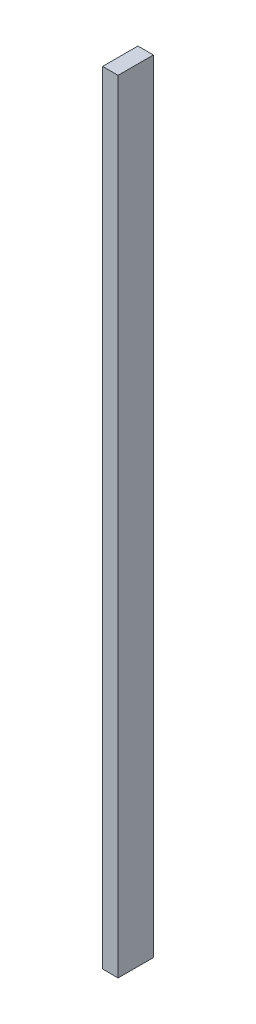
ISO-10303-21;
HEADER;
FILE_DESCRIPTION(('STEP AP214'),'2;1');
FILE_NAME('part.step','',(''),(''),'','','');
FILE_SCHEMA(('AUTOMOTIVE_DESIGN { 1 0 10303 214 1 1 1 1 }'));
ENDSEC;
DATA;
#1=APPLICATION_CONTEXT('core data for automotive mechanical design processes');
#2=APPLICATION_PROTOCOL_DEFINITION('international standard','automotive_design',2000,#1);
#3=PRODUCT_CONTEXT('',#1,'mechanical');
#4=PRODUCT('Part','Part','',(#3));
#5=PRODUCT_RELATED_PRODUCT_CATEGORY('part','',(#4));
#6=PRODUCT_DEFINITION_FORMATION('','',#4);
#7=PRODUCT_DEFINITION_CONTEXT('part definition',#1,'design');
#8=PRODUCT_DEFINITION('design','',#6,#7);
#9=PRODUCT_DEFINITION_SHAPE('','',#8);
#10=(LENGTH_UNIT() NAMED_UNIT(*) SI_UNIT(.MILLI.,.METRE.));
#11=(NAMED_UNIT(*) PLANE_ANGLE_UNIT() SI_UNIT($,.RADIAN.));
#12=(NAMED_UNIT(*) SI_UNIT($,.STERADIAN.) SOLID_ANGLE_UNIT());
#13=UNCERTAINTY_MEASURE_WITH_UNIT(LENGTH_MEASURE(1.E-05),#10,'distance_accuracy_value','');
#14=(GEOMETRIC_REPRESENTATION_CONTEXT(3) GLOBAL_UNCERTAINTY_ASSIGNED_CONTEXT((#13)) GLOBAL_UNIT_ASSIGNED_CONTEXT((#10,
#11,#12)) REPRESENTATION_CONTEXT('',''));
#15=CARTESIAN_POINT('',(0.,0.,0.));
#16=DIRECTION('',(0.,0.,1.));
#17=DIRECTION('',(1.,0.,0.));
#18=AXIS2_PLACEMENT_3D('',#15,#16,#17);
#19=CARTESIAN_POINT('',(50.8000000000068,5130.80000000001,-115.887499999998));
#20=DIRECTION('',(-1.,0.,0.));
#21=DIRECTION('',(0.,0.,1.));
#22=AXIS2_PLACEMENT_3D('',#19,#20,#21);
#23=PLANE('',#22);
#24=DIRECTION('',(0.,0.,-1.));
#25=VECTOR('',#24,1.);
#26=CARTESIAN_POINT('',(50.7999999999997,0.,-115.8875));
#27=LINE('',#26,#25);
#28=CARTESIAN_POINT('',(50.7999999999997,0.,115.8875));
#29=VERTEX_POINT('',#28);
#30=CARTESIAN_POINT('',(50.7999999999997,0.,-115.8875));
#31=VERTEX_POINT('',#30);
#32=EDGE_CURVE('E99',#29,#31,#27,.T.);
#33=ORIENTED_EDGE('',*,*,#32,.T.);
#34=DIRECTION('',(0.,-1.,0.));
#35=VECTOR('',#34,1.);
#36=CARTESIAN_POINT('',(50.8000000000068,5130.80000000001,-115.887499999998));
#37=LINE('',#36,#35);
#38=CARTESIAN_POINT('',(50.8000000000068,5130.80000000001,-115.887499999998));
#39=VERTEX_POINT('',#38);
#40=EDGE_CURVE('E11',#39,#31,#37,.T.);
#41=ORIENTED_EDGE('',*,*,#40,.F.);
#42=DIRECTION('',(0.,0.,-1.));
#43=VECTOR('',#42,1.);
#44=CARTESIAN_POINT('',(50.8000000000068,5130.80000000001,-115.887499999998));
#45=LINE('',#44,#43);
#46=CARTESIAN_POINT('',(50.8000000000042,5130.80000000001,115.887500000002));
#47=VERTEX_POINT('',#46);
#48=EDGE_CURVE('E87',#47,#39,#45,.T.);
#49=ORIENTED_EDGE('',*,*,#48,.F.);
#50=DIRECTION('',(0.,-1.,0.));
#51=VECTOR('',#50,1.);
#52=CARTESIAN_POINT('',(50.8000000000042,5130.80000000001,115.887500000002));
#53=LINE('',#52,#51);
#54=EDGE_CURVE('E95',#47,#29,#53,.T.);
#55=ORIENTED_EDGE('',*,*,#54,.T.);
#56=EDGE_LOOP('',(#33,#41,#49,#55));
#57=FACE_BOUND('',#56,.T.);
#58=ADVANCED_FACE('F36',(#57),#23,.F.);
#59=CARTESIAN_POINT('',(-50.7999999999935,5130.80000000001,-115.887499999998));
#60=DIRECTION('',(0.,0.,1.));
#61=DIRECTION('',(1.,0.,0.));
#62=AXIS2_PLACEMENT_3D('',#59,#60,#61);
#63=PLANE('',#62);
#64=DIRECTION('',(-1.,0.,0.));
#65=VECTOR('',#64,1.);
#66=CARTESIAN_POINT('',(-50.7999999999997,0.,-115.887499999998));
#67=LINE('',#66,#65);
#68=CARTESIAN_POINT('',(-50.7999999999997,0.,-115.887499999998));
#69=VERTEX_POINT('',#68);
#70=EDGE_CURVE('E91',#31,#69,#67,.T.);
#71=ORIENTED_EDGE('',*,*,#70,.T.);
#72=DIRECTION('',(0.,-1.,0.));
#73=VECTOR('',#72,1.);
#74=CARTESIAN_POINT('',(-50.7999999999935,5130.80000000001,-115.887499999998));
#75=LINE('',#74,#73);
#76=CARTESIAN_POINT('',(-50.7999999999935,5130.80000000001,-115.887499999998));
#77=VERTEX_POINT('',#76);
#78=EDGE_CURVE('E44',#77,#69,#75,.T.);
#79=ORIENTED_EDGE('',*,*,#78,.F.);
#80=DIRECTION('',(-1.,0.,0.));
#81=VECTOR('',#80,1.);
#82=CARTESIAN_POINT('',(-50.7999999999935,5130.80000000001,-115.887499999998));
#83=LINE('',#82,#81);
#84=EDGE_CURVE('E82',#39,#77,#83,.T.);
#85=ORIENTED_EDGE('',*,*,#84,.F.);
#86=ORIENTED_EDGE('',*,*,#40,.T.);
#87=EDGE_LOOP('',(#71,#79,#85,#86));
#88=FACE_BOUND('',#87,.T.);
#89=ADVANCED_FACE('F90',(#88),#63,.F.);
#90=CARTESIAN_POINT('',(-50.7999999999935,5130.80000000001,-115.887499999998));
#91=DIRECTION('',(1.,0.,0.));
#92=DIRECTION('',(0.,0.,-1.));
#93=AXIS2_PLACEMENT_3D('',#90,#91,#92);
#94=PLANE('',#93);
#95=DIRECTION('',(0.,0.,1.));
#96=VECTOR('',#95,1.);
#97=CARTESIAN_POINT('',(-50.7999999999997,0.,-115.887499999998));
#98=LINE('',#97,#96);
#99=CARTESIAN_POINT('',(-50.7999999999997,0.,115.887500000002));
#100=VERTEX_POINT('',#99);
#101=EDGE_CURVE('E69',#69,#100,#98,.T.);
#102=ORIENTED_EDGE('',*,*,#101,.T.);
#103=DIRECTION('',(0.,-1.,0.));
#104=VECTOR('',#103,1.);
#105=CARTESIAN_POINT('',(-50.7999999999962,5130.80000000001,115.887500000002));
#106=LINE('',#105,#104);
#107=CARTESIAN_POINT('',(-50.7999999999962,5130.80000000001,115.887500000002));
#108=VERTEX_POINT('',#107);
#109=EDGE_CURVE('E92',#108,#100,#106,.T.);
#110=ORIENTED_EDGE('',*,*,#109,.F.);
#111=DIRECTION('',(0.,0.,1.));
#112=VECTOR('',#111,1.);
#113=CARTESIAN_POINT('',(-50.7999999999935,5130.80000000001,-115.887499999998));
#114=LINE('',#113,#112);
#115=EDGE_CURVE('E85',#77,#108,#114,.T.);
#116=ORIENTED_EDGE('',*,*,#115,.F.);
#117=ORIENTED_EDGE('',*,*,#78,.T.);
#118=EDGE_LOOP('',(#102,#110,#116,#117));
#119=FACE_BOUND('',#118,.T.);
#120=ADVANCED_FACE('F93',(#119),#94,.F.);
#121=CARTESIAN_POINT('',(-50.7999999999962,5130.80000000001,115.887500000002));
#122=DIRECTION('',(0.,0.,-1.));
#123=DIRECTION('',(-1.,0.,0.));
#124=AXIS2_PLACEMENT_3D('',#121,#122,#123);
#125=PLANE('',#124);
#126=DIRECTION('',(1.,0.,0.));
#127=VECTOR('',#126,1.);
#128=CARTESIAN_POINT('',(-50.7999999999997,0.,115.887500000002));
#129=LINE('',#128,#127);
#130=EDGE_CURVE('E75',#100,#29,#129,.T.);
#131=ORIENTED_EDGE('',*,*,#130,.T.);
#132=ORIENTED_EDGE('',*,*,#54,.F.);
#133=DIRECTION('',(1.,0.,0.));
#134=VECTOR('',#133,1.);
#135=CARTESIAN_POINT('',(-50.7999999999962,5130.80000000001,115.887500000002));
#136=LINE('',#135,#134);
#137=EDGE_CURVE('E52',#108,#47,#136,.T.);
#138=ORIENTED_EDGE('',*,*,#137,.F.);
#139=ORIENTED_EDGE('',*,*,#109,.T.);
#140=EDGE_LOOP('',(#131,#132,#138,#139));
#141=FACE_BOUND('',#140,.T.);
#142=ADVANCED_FACE('F106',(#141),#125,.F.);
#143=CARTESIAN_POINT('',(7.105427357601E-12,5130.80000000001,1.77635683940025E-12));
#144=DIRECTION('',(0.,1.,0.));
#145=DIRECTION('',(0.,0.,1.));
#146=AXIS2_PLACEMENT_3D('',#143,#144,#145);
#147=PLANE('',#146);
#148=ORIENTED_EDGE('',*,*,#48,.T.);
#149=ORIENTED_EDGE('',*,*,#84,.T.);
#150=ORIENTED_EDGE('',*,*,#115,.T.);
#151=ORIENTED_EDGE('',*,*,#137,.T.);
#152=EDGE_LOOP('',(#148,#149,#150,#151));
#153=FACE_BOUND('',#152,.T.);
#154=ADVANCED_FACE('F83',(#153),#147,.T.);
#155=CARTESIAN_POINT('',(0.,0.,0.));
#156=DIRECTION('',(0.,1.,0.));
#157=DIRECTION('',(0.,0.,1.));
#158=AXIS2_PLACEMENT_3D('',#155,#156,#157);
#159=PLANE('',#158);
#160=ORIENTED_EDGE('',*,*,#32,.F.);
#161=ORIENTED_EDGE('',*,*,#130,.F.);
#162=ORIENTED_EDGE('',*,*,#101,.F.);
#163=ORIENTED_EDGE('',*,*,#70,.F.);
#164=EDGE_LOOP('',(#160,#161,#162,#163));
#165=FACE_BOUND('',#164,.T.);
#166=ADVANCED_FACE('F109',(#165),#159,.F.);
#167=CLOSED_SHELL('',(#58,#89,#120,#142,#154,#166));
#168=MANIFOLD_SOLID_BREP('B2',#167);
#169=ADVANCED_BREP_SHAPE_REPRESENTATION('',(#18,#168),#14);
#170=SHAPE_DEFINITION_REPRESENTATION(#9,#169);
ENDSEC;
END-ISO-10303-21;
